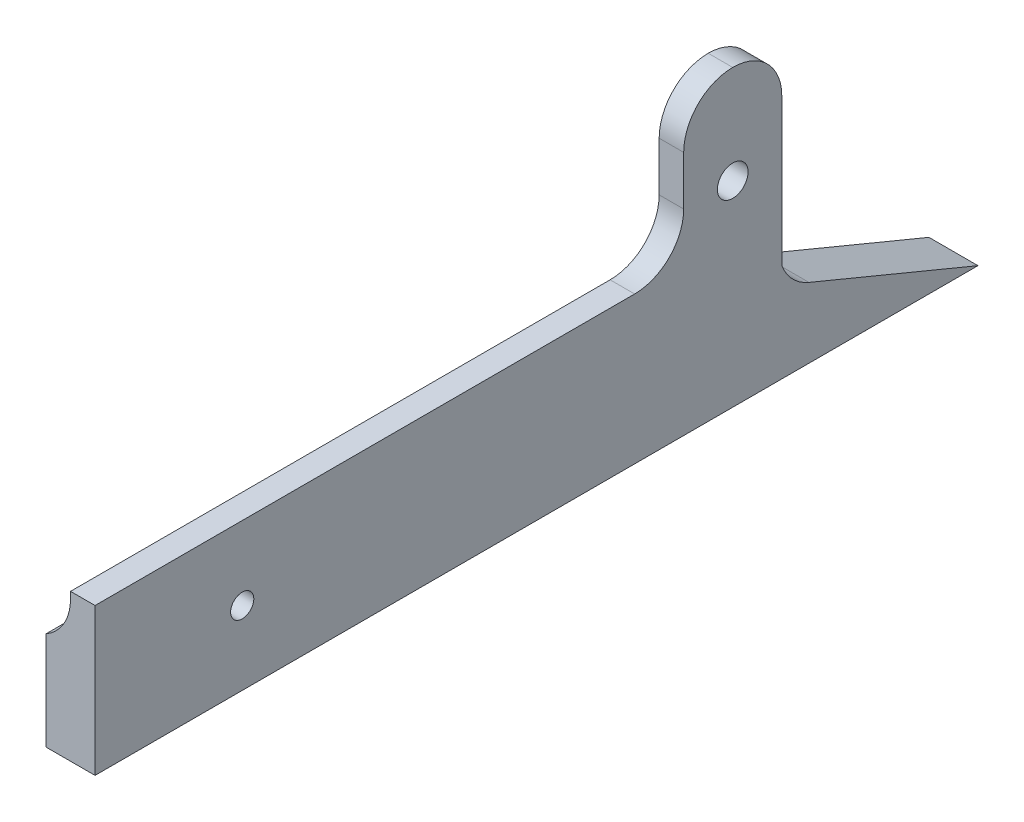
ISO-10303-21;
HEADER;
FILE_DESCRIPTION(('STEP AP214'),'2;1');
FILE_NAME('part.step','',(''),(''),'','','');
FILE_SCHEMA(('AUTOMOTIVE_DESIGN { 1 0 10303 214 1 1 1 1 }'));
ENDSEC;
DATA;
#1=APPLICATION_CONTEXT('core data for automotive mechanical design processes');
#2=APPLICATION_PROTOCOL_DEFINITION('international standard','automotive_design',2000,#1);
#3=PRODUCT_CONTEXT('',#1,'mechanical');
#4=PRODUCT('Part','Part','',(#3));
#5=PRODUCT_RELATED_PRODUCT_CATEGORY('part','',(#4));
#6=PRODUCT_DEFINITION_FORMATION('','',#4);
#7=PRODUCT_DEFINITION_CONTEXT('part definition',#1,'design');
#8=PRODUCT_DEFINITION('design','',#6,#7);
#9=PRODUCT_DEFINITION_SHAPE('','',#8);
#10=(LENGTH_UNIT() NAMED_UNIT(*) SI_UNIT(.MILLI.,.METRE.));
#11=(NAMED_UNIT(*) PLANE_ANGLE_UNIT() SI_UNIT($,.RADIAN.));
#12=(NAMED_UNIT(*) SI_UNIT($,.STERADIAN.) SOLID_ANGLE_UNIT());
#13=UNCERTAINTY_MEASURE_WITH_UNIT(LENGTH_MEASURE(1.E-05),#10,'distance_accuracy_value','');
#14=(GEOMETRIC_REPRESENTATION_CONTEXT(3) GLOBAL_UNCERTAINTY_ASSIGNED_CONTEXT((#13)) GLOBAL_UNIT_ASSIGNED_CONTEXT((#10,
#11,#12)) REPRESENTATION_CONTEXT('',''));
#15=CARTESIAN_POINT('',(0.,0.,0.));
#16=DIRECTION('',(0.,0.,1.));
#17=DIRECTION('',(1.,0.,0.));
#18=AXIS2_PLACEMENT_3D('',#15,#16,#17);
#19=CARTESIAN_POINT('',(6.35,-6.35,25.4));
#20=DIRECTION('',(0.,0.,-1.));
#21=DIRECTION('',(0.,1.,0.));
#22=AXIS2_PLACEMENT_3D('',#19,#20,#21);
#23=PLANE('',#22);
#24=DIRECTION('',(0.,-1.,0.));
#25=VECTOR('',#24,1.);
#26=CARTESIAN_POINT('',(6.35,-6.35,25.4));
#27=LINE('',#26,#25);
#28=CARTESIAN_POINT('',(6.35,57.15,25.4));
#29=VERTEX_POINT('',#28);
#30=CARTESIAN_POINT('',(6.35,44.45,25.4));
#31=VERTEX_POINT('',#30);
#32=EDGE_CURVE('E177',#29,#31,#27,.T.);
#33=ORIENTED_EDGE('',*,*,#32,.T.);
#34=DIRECTION('',(-1.,0.,0.));
#35=VECTOR('',#34,1.);
#36=CARTESIAN_POINT('',(12.7,44.45,25.4));
#37=LINE('',#36,#35);
#38=CARTESIAN_POINT('',(12.7,44.45,25.4));
#39=VERTEX_POINT('',#38);
#40=EDGE_CURVE('E65',#31,#39,#37,.F.);
#41=ORIENTED_EDGE('',*,*,#40,.T.);
#42=DIRECTION('',(0.,-1.,0.));
#43=VECTOR('',#42,1.);
#44=CARTESIAN_POINT('',(12.7,-6.35,25.4));
#45=LINE('',#44,#43);
#46=CARTESIAN_POINT('',(12.7,57.15,25.4));
#47=VERTEX_POINT('',#46);
#48=EDGE_CURVE('E178',#47,#39,#45,.T.);
#49=ORIENTED_EDGE('',*,*,#48,.F.);
#50=DIRECTION('',(-1.,0.,0.));
#51=VECTOR('',#50,1.);
#52=CARTESIAN_POINT('',(6.35,57.15,25.4));
#53=LINE('',#52,#51);
#54=EDGE_CURVE('E245',#47,#29,#53,.T.);
#55=ORIENTED_EDGE('',*,*,#54,.T.);
#56=EDGE_LOOP('',(#33,#41,#49,#55));
#57=FACE_BOUND('',#56,.T.);
#58=ADVANCED_FACE('F43',(#57),#23,.F.);
#59=CARTESIAN_POINT('',(6.35,-6.34999999999999,-50.8));
#60=DIRECTION('',(0.,1.,0.));
#61=DIRECTION('',(0.,0.,1.));
#62=AXIS2_PLACEMENT_3D('',#59,#60,#61);
#63=PLANE('',#62);
#64=DIRECTION('',(0.,0.,-1.));
#65=VECTOR('',#64,1.);
#66=CARTESIAN_POINT('',(0.,-6.34999999999999,-50.8));
#67=LINE('',#66,#65);
#68=CARTESIAN_POINT('',(0.,-6.35,177.8));
#69=VERTEX_POINT('',#68);
#70=CARTESIAN_POINT('',(0.,-6.34999999999999,-50.8));
#71=VERTEX_POINT('',#70);
#72=EDGE_CURVE('E203',#69,#71,#67,.T.);
#73=ORIENTED_EDGE('',*,*,#72,.T.);
#74=DIRECTION('',(-1.,0.,0.));
#75=VECTOR('',#74,1.);
#76=CARTESIAN_POINT('',(6.35,-6.34999999999999,-50.8));
#77=LINE('',#76,#75);
#78=CARTESIAN_POINT('',(12.7,-6.34999999999999,-50.8));
#79=VERTEX_POINT('',#78);
#80=EDGE_CURVE('E213',#79,#71,#77,.T.);
#81=ORIENTED_EDGE('',*,*,#80,.F.);
#82=DIRECTION('',(0.,0.,-1.));
#83=VECTOR('',#82,1.);
#84=CARTESIAN_POINT('',(12.7,-6.35,25.4));
#85=LINE('',#84,#83);
#86=CARTESIAN_POINT('',(12.7,-6.35,177.8));
#87=VERTEX_POINT('',#86);
#88=EDGE_CURVE('E181',#87,#79,#85,.T.);
#89=ORIENTED_EDGE('',*,*,#88,.F.);
#90=DIRECTION('',(1.,0.,0.));
#91=VECTOR('',#90,1.);
#92=CARTESIAN_POINT('',(0.,-6.35,177.8));
#93=LINE('',#92,#91);
#94=EDGE_CURVE('E150',#69,#87,#93,.T.);
#95=ORIENTED_EDGE('',*,*,#94,.F.);
#96=EDGE_LOOP('',(#73,#81,#89,#95));
#97=FACE_BOUND('',#96,.T.);
#98=ADVANCED_FACE('F272',(#97),#63,.F.);
#99=CARTESIAN_POINT('',(6.35,14.6920489685529,0.));
#100=DIRECTION('',(0.,-0.923879532511289,0.382683432365084));
#101=DIRECTION('',(0.,-0.382683432365084,-0.923879532511289));
#102=AXIS2_PLACEMENT_3D('',#99,#100,#101);
#103=PLANE('',#102);
#104=DIRECTION('',(0.,0.382683432365084,0.923879532511289));
#105=VECTOR('',#104,1.);
#106=CARTESIAN_POINT('',(0.,14.6920489685529,0.));
#107=LINE('',#106,#105);
#108=CARTESIAN_POINT('',(0.,11.7802495571286,-7.02970562997053));
#109=VERTEX_POINT('',#108);
#110=EDGE_CURVE('E206',#71,#109,#107,.T.);
#111=ORIENTED_EDGE('',*,*,#110,.T.);
#112=DIRECTION('',(1.,0.,0.));
#113=VECTOR('',#112,1.);
#114=CARTESIAN_POINT('',(6.35,11.7802495571286,-7.02970562997053));
#115=LINE('',#114,#113);
#116=CARTESIAN_POINT('',(12.7,11.7802495571286,-7.02970562997053));
#117=VERTEX_POINT('',#116);
#118=EDGE_CURVE('E217',#109,#117,#115,.T.);
#119=ORIENTED_EDGE('',*,*,#118,.T.);
#120=DIRECTION('',(0.,0.382683432365084,0.923879532511289));
#121=VECTOR('',#120,1.);
#122=CARTESIAN_POINT('',(12.7,-6.34999999999999,-50.8));
#123=LINE('',#122,#121);
#124=EDGE_CURVE('E185',#79,#117,#123,.T.);
#125=ORIENTED_EDGE('',*,*,#124,.F.);
#126=ORIENTED_EDGE('',*,*,#80,.T.);
#127=EDGE_LOOP('',(#111,#119,#125,#126));
#128=FACE_BOUND('',#127,.T.);
#129=ADVANCED_FACE('F276',(#128),#103,.F.);
#130=CARTESIAN_POINT('',(0.,0.,0.));
#131=DIRECTION('',(-1.,0.,0.));
#132=DIRECTION('',(0.,0.,1.));
#133=AXIS2_PLACEMENT_3D('',#130,#131,#132);
#134=PLANE('',#133);
#135=CARTESIAN_POINT('',(0.,12.7,139.7));
#136=DIRECTION('',(-1.,0.,0.));
#137=DIRECTION('',(0.,0.,1.));
#138=AXIS2_PLACEMENT_3D('',#135,#136,#137);
#139=CIRCLE('',#138,2.99999999999999);
#140=CARTESIAN_POINT('',(0.,12.7,142.7));
#141=VERTEX_POINT('',#140);
#142=EDGE_CURVE('E501',#141,#141,#139,.T.);
#143=ORIENTED_EDGE('',*,*,#142,.F.);
#144=EDGE_LOOP('',(#143));
#145=FACE_BOUND('',#144,.T.);
#146=ORIENTED_EDGE('',*,*,#72,.F.);
#147=DIRECTION('',(0.,-1.,0.));
#148=VECTOR('',#147,1.);
#149=CARTESIAN_POINT('',(0.,19.05,177.8));
#150=LINE('',#149,#148);
#151=CARTESIAN_POINT('',(0.,19.05,177.8));
#152=VERTEX_POINT('',#151);
#153=EDGE_CURVE('E263',#152,#69,#150,.T.);
#154=ORIENTED_EDGE('',*,*,#153,.F.);
#155=DIRECTION('',(0.,0.,1.));
#156=VECTOR('',#155,1.);
#157=CARTESIAN_POINT('',(0.,19.05,25.4));
#158=LINE('',#157,#156);
#159=CARTESIAN_POINT('',(0.,19.05,0.));
#160=VERTEX_POINT('',#159);
#161=EDGE_CURVE('E210',#160,#152,#158,.T.);
#162=ORIENTED_EDGE('',*,*,#161,.F.);
#163=CARTESIAN_POINT('',(0.,23.513519620022,-11.8897852210071));
#164=DIRECTION('',(-1.,0.,0.));
#165=DIRECTION('',(0.,0.,1.));
#166=AXIS2_PLACEMENT_3D('',#163,#164,#165);
#167=CIRCLE('',#166,12.7);
#168=EDGE_CURVE('E220',#160,#109,#167,.F.);
#169=ORIENTED_EDGE('',*,*,#168,.T.);
#170=ORIENTED_EDGE('',*,*,#110,.F.);
#171=EDGE_LOOP('',(#146,#154,#162,#169,#170));
#172=FACE_BOUND('',#171,.T.);
#173=ADVANCED_FACE('F299',(#145,#172),#134,.T.);
#174=CARTESIAN_POINT('',(6.35,23.513519620022,-11.8897852210071));
#175=DIRECTION('',(1.,0.,0.));
#176=DIRECTION('',(0.,0.,-1.));
#177=AXIS2_PLACEMENT_3D('',#174,#175,#176);
#178=CYLINDRICAL_SURFACE('',#177,12.7);
#179=ORIENTED_EDGE('',*,*,#168,.F.);
#180=DIRECTION('',(-1.,0.,0.));
#181=VECTOR('',#180,1.);
#182=CARTESIAN_POINT('',(12.7,19.05,0.));
#183=LINE('',#182,#181);
#184=CARTESIAN_POINT('',(12.7,19.05,0.));
#185=VERTEX_POINT('',#184);
#186=EDGE_CURVE('E195',#185,#160,#183,.T.);
#187=ORIENTED_EDGE('',*,*,#186,.F.);
#188=CARTESIAN_POINT('',(12.7,23.513519620022,-11.8897852210071));
#189=DIRECTION('',(-1.,0.,0.));
#190=DIRECTION('',(0.,0.,-1.));
#191=AXIS2_PLACEMENT_3D('',#188,#189,#190);
#192=CIRCLE('',#191,12.7);
#193=EDGE_CURVE('E189',#117,#185,#192,.T.);
#194=ORIENTED_EDGE('',*,*,#193,.F.);
#195=ORIENTED_EDGE('',*,*,#118,.F.);
#196=EDGE_LOOP('',(#179,#187,#194,#195));
#197=FACE_BOUND('',#196,.T.);
#198=ADVANCED_FACE('F281',(#197),#178,.F.);
#199=CARTESIAN_POINT('',(6.35,23.513519620022,-11.8897852210071));
#200=DIRECTION('',(1.,0.,0.));
#201=DIRECTION('',(0.,0.,-1.));
#202=AXIS2_PLACEMENT_3D('',#199,#200,#201);
#203=PLANE('',#202);
#204=CARTESIAN_POINT('',(6.35,44.45,12.7));
#205=DIRECTION('',(1.,0.,0.));
#206=DIRECTION('',(0.,0.,-1.));
#207=AXIS2_PLACEMENT_3D('',#204,#205,#206);
#208=CIRCLE('',#207,3.96875);
#209=CARTESIAN_POINT('',(6.35,44.45,8.73124999999999));
#210=VERTEX_POINT('',#209);
#211=EDGE_CURVE('E173',#210,#210,#208,.T.);
#212=ORIENTED_EDGE('',*,*,#211,.T.);
#213=EDGE_LOOP('',(#212));
#214=FACE_BOUND('',#213,.T.);
#215=CARTESIAN_POINT('',(6.35,57.15,12.7));
#216=DIRECTION('',(1.,0.,0.));
#217=DIRECTION('',(0.,0.,-1.));
#218=AXIS2_PLACEMENT_3D('',#215,#216,#217);
#219=CIRCLE('',#218,12.7);
#220=CARTESIAN_POINT('',(6.35,69.85,12.7));
#221=VERTEX_POINT('',#220);
#222=EDGE_CURVE('E229',#29,#221,#219,.F.);
#223=ORIENTED_EDGE('',*,*,#222,.T.);
#224=CARTESIAN_POINT('',(6.35,57.15,12.7));
#225=DIRECTION('',(1.,0.,0.));
#226=DIRECTION('',(0.,0.,-1.));
#227=AXIS2_PLACEMENT_3D('',#224,#225,#226);
#228=CIRCLE('',#227,12.7);
#229=CARTESIAN_POINT('',(6.35,57.15,0.));
#230=VERTEX_POINT('',#229);
#231=EDGE_CURVE('E232',#221,#230,#228,.F.);
#232=ORIENTED_EDGE('',*,*,#231,.T.);
#233=DIRECTION('',(0.,1.,0.));
#234=VECTOR('',#233,1.);
#235=CARTESIAN_POINT('',(6.35,19.05,0.));
#236=LINE('',#235,#234);
#237=CARTESIAN_POINT('',(6.35,30.0485226280624,0.));
#238=VERTEX_POINT('',#237);
#239=EDGE_CURVE('E182',#238,#230,#236,.T.);
#240=ORIENTED_EDGE('',*,*,#239,.F.);
#241=DIRECTION('',(0.,0.,-1.));
#242=VECTOR('',#241,1.);
#243=CARTESIAN_POINT('',(6.35,30.0485226280624,-11.8897852210071));
#244=LINE('',#243,#242);
#245=CARTESIAN_POINT('',(6.35,30.0485226280624,177.8));
#246=VERTEX_POINT('',#245);
#247=EDGE_CURVE('E223',#238,#246,#244,.F.);
#248=ORIENTED_EDGE('',*,*,#247,.T.);
#249=DIRECTION('',(0.,-1.,0.));
#250=VECTOR('',#249,1.);
#251=CARTESIAN_POINT('',(6.35,30.0485226280623,177.8));
#252=LINE('',#251,#250);
#253=CARTESIAN_POINT('',(6.35,31.75,177.8));
#254=VERTEX_POINT('',#253);
#255=EDGE_CURVE('E142',#254,#246,#252,.T.);
#256=ORIENTED_EDGE('',*,*,#255,.F.);
#257=DIRECTION('',(0.,0.,-1.));
#258=VECTOR('',#257,1.);
#259=CARTESIAN_POINT('',(6.35,31.75,177.8));
#260=LINE('',#259,#258);
#261=CARTESIAN_POINT('',(6.35,31.75,38.1000000000001));
#262=VERTEX_POINT('',#261);
#263=EDGE_CURVE('E137',#254,#262,#260,.T.);
#264=ORIENTED_EDGE('',*,*,#263,.T.);
#265=CARTESIAN_POINT('',(6.35,44.45,38.1));
#266=DIRECTION('',(1.,0.,0.));
#267=DIRECTION('',(0.,0.,-1.));
#268=AXIS2_PLACEMENT_3D('',#265,#266,#267);
#269=CIRCLE('',#268,12.7);
#270=EDGE_CURVE('E52',#262,#31,#269,.T.);
#271=ORIENTED_EDGE('',*,*,#270,.T.);
#272=ORIENTED_EDGE('',*,*,#32,.F.);
#273=EDGE_LOOP('',(#223,#232,#240,#248,#256,#264,#271,#272));
#274=FACE_BOUND('',#273,.T.);
#275=ADVANCED_FACE('F254',(#214,#274),#203,.F.);
#276=CARTESIAN_POINT('',(12.7,19.05,0.));
#277=DIRECTION('',(0.,0.,1.));
#278=DIRECTION('',(0.,-1.,0.));
#279=AXIS2_PLACEMENT_3D('',#276,#277,#278);
#280=PLANE('',#279);
#281=ORIENTED_EDGE('',*,*,#239,.T.);
#282=DIRECTION('',(-1.,0.,0.));
#283=VECTOR('',#282,1.);
#284=CARTESIAN_POINT('',(12.7,57.15,0.));
#285=LINE('',#284,#283);
#286=CARTESIAN_POINT('',(12.7,57.15,0.));
#287=VERTEX_POINT('',#286);
#288=EDGE_CURVE('E235',#230,#287,#285,.F.);
#289=ORIENTED_EDGE('',*,*,#288,.T.);
#290=DIRECTION('',(0.,1.,0.));
#291=VECTOR('',#290,1.);
#292=CARTESIAN_POINT('',(12.7,19.05,0.));
#293=LINE('',#292,#291);
#294=EDGE_CURVE('E192',#185,#287,#293,.T.);
#295=ORIENTED_EDGE('',*,*,#294,.F.);
#296=ORIENTED_EDGE('',*,*,#186,.T.);
#297=CARTESIAN_POINT('',(-6.35,30.0485226280624,0.));
#298=DIRECTION('',(0.,0.,1.));
#299=DIRECTION('',(0.,-1.,0.));
#300=AXIS2_PLACEMENT_3D('',#297,#298,#299);
#301=CIRCLE('',#300,12.7);
#302=EDGE_CURVE('E226',#160,#238,#301,.T.);
#303=ORIENTED_EDGE('',*,*,#302,.T.);
#304=EDGE_LOOP('',(#281,#289,#295,#296,#303));
#305=FACE_BOUND('',#304,.T.);
#306=ADVANCED_FACE('F286',(#305),#280,.F.);
#307=CARTESIAN_POINT('',(12.7,23.513519620022,-11.8897852210071));
#308=DIRECTION('',(1.,0.,0.));
#309=DIRECTION('',(0.,0.,-1.));
#310=AXIS2_PLACEMENT_3D('',#307,#308,#309);
#311=PLANE('',#310);
#312=CARTESIAN_POINT('',(12.7,12.7,139.7));
#313=DIRECTION('',(-1.,0.,0.));
#314=DIRECTION('',(0.,0.,1.));
#315=AXIS2_PLACEMENT_3D('',#312,#313,#314);
#316=CIRCLE('',#315,2.99999999999999);
#317=CARTESIAN_POINT('',(12.7,12.7,142.7));
#318=VERTEX_POINT('',#317);
#319=EDGE_CURVE('E154',#318,#318,#316,.T.);
#320=ORIENTED_EDGE('',*,*,#319,.T.);
#321=EDGE_LOOP('',(#320));
#322=FACE_BOUND('',#321,.T.);
#323=CARTESIAN_POINT('',(12.7,44.45,12.7));
#324=DIRECTION('',(1.,0.,0.));
#325=DIRECTION('',(0.,0.,-1.));
#326=AXIS2_PLACEMENT_3D('',#323,#324,#325);
#327=CIRCLE('',#326,3.96875);
#328=CARTESIAN_POINT('',(12.7,44.45,8.73124999999999));
#329=VERTEX_POINT('',#328);
#330=EDGE_CURVE('E165',#329,#329,#327,.T.);
#331=ORIENTED_EDGE('',*,*,#330,.F.);
#332=EDGE_LOOP('',(#331));
#333=FACE_BOUND('',#332,.T.);
#334=ORIENTED_EDGE('',*,*,#294,.T.);
#335=CARTESIAN_POINT('',(12.7,57.15,12.7));
#336=DIRECTION('',(1.,0.,0.));
#337=DIRECTION('',(0.,0.,-1.));
#338=AXIS2_PLACEMENT_3D('',#335,#336,#337);
#339=CIRCLE('',#338,12.7);
#340=CARTESIAN_POINT('',(12.7,69.85,12.7));
#341=VERTEX_POINT('',#340);
#342=EDGE_CURVE('E242',#287,#341,#339,.T.);
#343=ORIENTED_EDGE('',*,*,#342,.T.);
#344=CARTESIAN_POINT('',(12.7,57.15,12.7));
#345=DIRECTION('',(1.,0.,0.));
#346=DIRECTION('',(0.,0.,-1.));
#347=AXIS2_PLACEMENT_3D('',#344,#345,#346);
#348=CIRCLE('',#347,12.7);
#349=EDGE_CURVE('E239',#341,#47,#348,.T.);
#350=ORIENTED_EDGE('',*,*,#349,.T.);
#351=ORIENTED_EDGE('',*,*,#48,.T.);
#352=CARTESIAN_POINT('',(12.7,44.45,38.1));
#353=DIRECTION('',(1.,0.,0.));
#354=DIRECTION('',(0.,0.,-1.));
#355=AXIS2_PLACEMENT_3D('',#352,#353,#354);
#356=CIRCLE('',#355,12.7);
#357=CARTESIAN_POINT('',(12.7,31.75,38.1000000000001));
#358=VERTEX_POINT('',#357);
#359=EDGE_CURVE('E11',#39,#358,#356,.F.);
#360=ORIENTED_EDGE('',*,*,#359,.T.);
#361=DIRECTION('',(0.,0.,-1.));
#362=VECTOR('',#361,1.);
#363=CARTESIAN_POINT('',(12.7,31.75,177.8));
#364=LINE('',#363,#362);
#365=CARTESIAN_POINT('',(12.7,31.75,177.8));
#366=VERTEX_POINT('',#365);
#367=EDGE_CURVE('E135',#366,#358,#364,.T.);
#368=ORIENTED_EDGE('',*,*,#367,.F.);
#369=DIRECTION('',(0.,1.,0.));
#370=VECTOR('',#369,1.);
#371=CARTESIAN_POINT('',(12.7,31.75,177.8));
#372=LINE('',#371,#370);
#373=EDGE_CURVE('E143',#87,#366,#372,.T.);
#374=ORIENTED_EDGE('',*,*,#373,.F.);
#375=ORIENTED_EDGE('',*,*,#88,.T.);
#376=ORIENTED_EDGE('',*,*,#124,.T.);
#377=ORIENTED_EDGE('',*,*,#193,.T.);
#378=EDGE_LOOP('',(#334,#343,#350,#351,#360,#368,#374,#375,#376,#377));
#379=FACE_BOUND('',#378,.T.);
#380=ADVANCED_FACE('F157',(#322,#333,#379),#311,.T.);
#381=CARTESIAN_POINT('',(-6.35,30.0485226280624,25.4));
#382=DIRECTION('',(0.,0.,-1.));
#383=DIRECTION('',(-1.,0.,0.));
#384=AXIS2_PLACEMENT_3D('',#381,#382,#383);
#385=CYLINDRICAL_SURFACE('',#384,12.7);
#386=ORIENTED_EDGE('',*,*,#302,.F.);
#387=ORIENTED_EDGE('',*,*,#161,.T.);
#388=CARTESIAN_POINT('',(-6.35,30.0485226280624,177.8));
#389=DIRECTION('',(0.,0.,-1.));
#390=DIRECTION('',(1.,0.,0.));
#391=AXIS2_PLACEMENT_3D('',#388,#389,#390);
#392=CIRCLE('',#391,12.7);
#393=EDGE_CURVE('E260',#246,#152,#392,.T.);
#394=ORIENTED_EDGE('',*,*,#393,.F.);
#395=ORIENTED_EDGE('',*,*,#247,.F.);
#396=EDGE_LOOP('',(#386,#387,#394,#395));
#397=FACE_BOUND('',#396,.T.);
#398=ADVANCED_FACE('F298',(#397),#385,.F.);
#399=CARTESIAN_POINT('',(0.,44.45,12.7));
#400=DIRECTION('',(1.,0.,0.));
#401=DIRECTION('',(0.,0.,-1.));
#402=AXIS2_PLACEMENT_3D('',#399,#400,#401);
#403=CYLINDRICAL_SURFACE('',#402,3.96875);
#404=ORIENTED_EDGE('',*,*,#330,.T.);
#405=EDGE_LOOP('',(#404));
#406=FACE_BOUND('',#405,.T.);
#407=ORIENTED_EDGE('',*,*,#211,.F.);
#408=EDGE_LOOP('',(#407));
#409=FACE_BOUND('',#408,.T.);
#410=ADVANCED_FACE('F320',(#406,#409),#403,.F.);
#411=CARTESIAN_POINT('',(6.35,57.15,12.7));
#412=DIRECTION('',(-1.,0.,0.));
#413=DIRECTION('',(0.,0.,1.));
#414=AXIS2_PLACEMENT_3D('',#411,#412,#413);
#415=CYLINDRICAL_SURFACE('',#414,12.7);
#416=ORIENTED_EDGE('',*,*,#54,.F.);
#417=ORIENTED_EDGE('',*,*,#349,.F.);
#418=DIRECTION('',(-1.,0.,0.));
#419=VECTOR('',#418,1.);
#420=CARTESIAN_POINT('',(12.7,69.85,12.7));
#421=LINE('',#420,#419);
#422=EDGE_CURVE('E160',#221,#341,#421,.F.);
#423=ORIENTED_EDGE('',*,*,#422,.F.);
#424=ORIENTED_EDGE('',*,*,#222,.F.);
#425=EDGE_LOOP('',(#416,#417,#423,#424));
#426=FACE_BOUND('',#425,.T.);
#427=ADVANCED_FACE('F295',(#426),#415,.T.);
#428=CARTESIAN_POINT('',(12.7,57.15,12.7));
#429=DIRECTION('',(-1.,0.,0.));
#430=DIRECTION('',(0.,0.,1.));
#431=AXIS2_PLACEMENT_3D('',#428,#429,#430);
#432=CYLINDRICAL_SURFACE('',#431,12.7);
#433=ORIENTED_EDGE('',*,*,#342,.F.);
#434=ORIENTED_EDGE('',*,*,#288,.F.);
#435=ORIENTED_EDGE('',*,*,#231,.F.);
#436=ORIENTED_EDGE('',*,*,#422,.T.);
#437=EDGE_LOOP('',(#433,#434,#435,#436));
#438=FACE_BOUND('',#437,.T.);
#439=ADVANCED_FACE('F290',(#438),#432,.T.);
#440=CARTESIAN_POINT('',(6.35,31.75,177.8));
#441=DIRECTION('',(0.,-1.,0.));
#442=DIRECTION('',(0.,0.,-1.));
#443=AXIS2_PLACEMENT_3D('',#440,#441,#442);
#444=PLANE('',#443);
#445=ORIENTED_EDGE('',*,*,#367,.T.);
#446=DIRECTION('',(-1.,0.,0.));
#447=VECTOR('',#446,1.);
#448=CARTESIAN_POINT('',(6.35,31.75,38.1));
#449=LINE('',#448,#447);
#450=EDGE_CURVE('E247',#358,#262,#449,.T.);
#451=ORIENTED_EDGE('',*,*,#450,.T.);
#452=ORIENTED_EDGE('',*,*,#263,.F.);
#453=DIRECTION('',(-1.,0.,0.));
#454=VECTOR('',#453,1.);
#455=CARTESIAN_POINT('',(6.35,31.75,177.8));
#456=LINE('',#455,#454);
#457=EDGE_CURVE('E130',#366,#254,#456,.T.);
#458=ORIENTED_EDGE('',*,*,#457,.F.);
#459=EDGE_LOOP('',(#445,#451,#452,#458));
#460=FACE_BOUND('',#459,.T.);
#461=ADVANCED_FACE('F132',(#460),#444,.F.);
#462=CARTESIAN_POINT('',(-6.35,30.0485226280624,177.8));
#463=DIRECTION('',(0.,0.,1.));
#464=DIRECTION('',(1.,0.,0.));
#465=AXIS2_PLACEMENT_3D('',#462,#463,#464);
#466=PLANE('',#465);
#467=ORIENTED_EDGE('',*,*,#373,.T.);
#468=ORIENTED_EDGE('',*,*,#457,.T.);
#469=ORIENTED_EDGE('',*,*,#255,.T.);
#470=ORIENTED_EDGE('',*,*,#393,.T.);
#471=ORIENTED_EDGE('',*,*,#153,.T.);
#472=ORIENTED_EDGE('',*,*,#94,.T.);
#473=EDGE_LOOP('',(#467,#468,#469,#470,#471,#472));
#474=FACE_BOUND('',#473,.T.);
#475=ADVANCED_FACE('F147',(#474),#466,.T.);
#476=CARTESIAN_POINT('',(6.35,44.45,38.1));
#477=DIRECTION('',(1.,0.,0.));
#478=DIRECTION('',(0.,0.,-1.));
#479=AXIS2_PLACEMENT_3D('',#476,#477,#478);
#480=CYLINDRICAL_SURFACE('',#479,12.7);
#481=ORIENTED_EDGE('',*,*,#359,.F.);
#482=ORIENTED_EDGE('',*,*,#40,.F.);
#483=ORIENTED_EDGE('',*,*,#270,.F.);
#484=ORIENTED_EDGE('',*,*,#450,.F.);
#485=EDGE_LOOP('',(#481,#482,#483,#484));
#486=FACE_BOUND('',#485,.T.);
#487=ADVANCED_FACE('F45',(#486),#480,.F.);
#488=CARTESIAN_POINT('',(12.7,12.7,139.7));
#489=DIRECTION('',(-1.,0.,0.));
#490=DIRECTION('',(0.,0.,1.));
#491=AXIS2_PLACEMENT_3D('',#488,#489,#490);
#492=CYLINDRICAL_SURFACE('',#491,2.99999999999999);
#493=ORIENTED_EDGE('',*,*,#319,.F.);
#494=EDGE_LOOP('',(#493));
#495=FACE_BOUND('',#494,.T.);
#496=ORIENTED_EDGE('',*,*,#142,.T.);
#497=EDGE_LOOP('',(#496));
#498=FACE_BOUND('',#497,.T.);
#499=ADVANCED_FACE('F393',(#495,#498),#492,.F.);
#500=CLOSED_SHELL('',(#58,#98,#129,#173,#198,#275,#306,#380,#398,#410,#427,#439,#461,#475,#487,#499));
#501=MANIFOLD_SOLID_BREP('B2',#500);
#502=ADVANCED_BREP_SHAPE_REPRESENTATION('',(#18,#501),#14);
#503=SHAPE_DEFINITION_REPRESENTATION(#9,#502);
ENDSEC;
END-ISO-10303-21;
